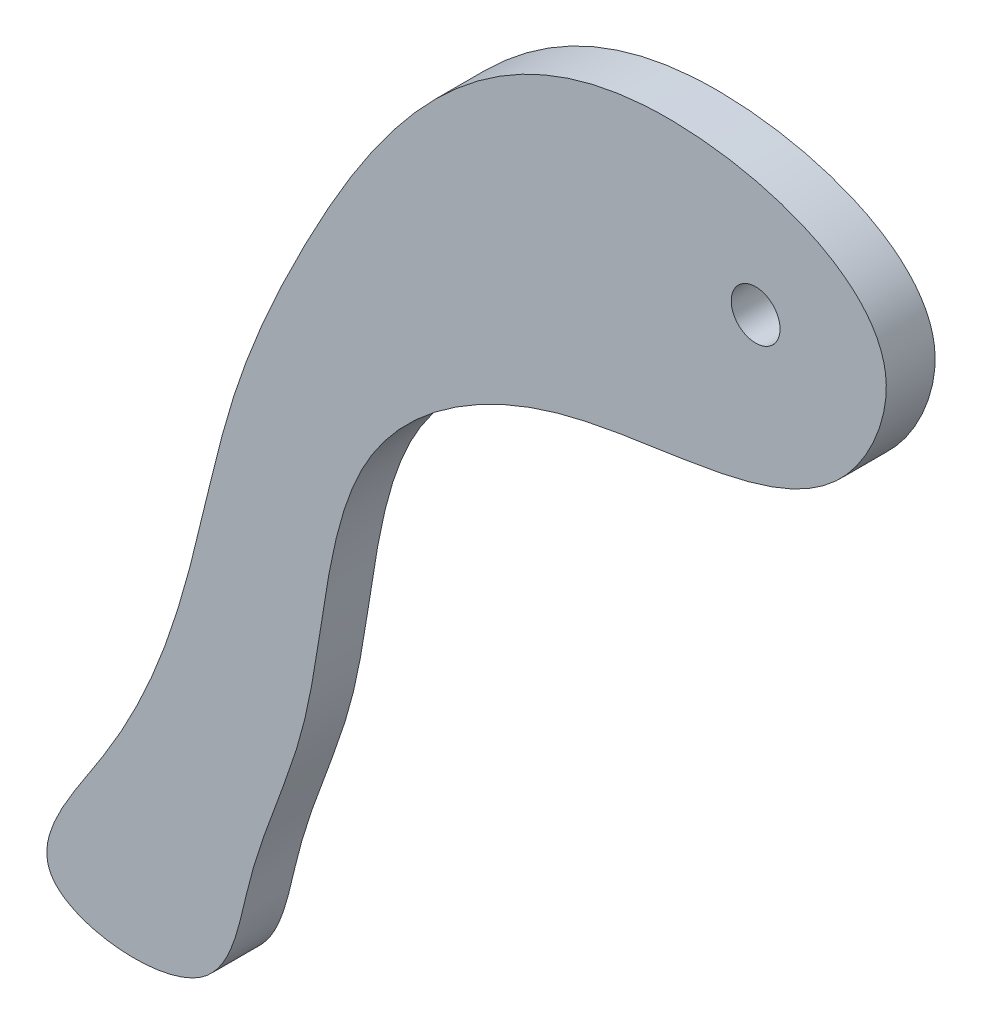
ISO-10303-21;
HEADER;
FILE_DESCRIPTION(('STEP AP214'),'2;1');
FILE_NAME('part.step','',(''),(''),'','','');
FILE_SCHEMA(('AUTOMOTIVE_DESIGN { 1 0 10303 214 1 1 1 1 }'));
ENDSEC;
DATA;
#1=APPLICATION_CONTEXT('core data for automotive mechanical design processes');
#2=APPLICATION_PROTOCOL_DEFINITION('international standard','automotive_design',2000,#1);
#3=PRODUCT_CONTEXT('',#1,'mechanical');
#4=PRODUCT('Part','Part','',(#3));
#5=PRODUCT_RELATED_PRODUCT_CATEGORY('part','',(#4));
#6=PRODUCT_DEFINITION_FORMATION('','',#4);
#7=PRODUCT_DEFINITION_CONTEXT('part definition',#1,'design');
#8=PRODUCT_DEFINITION('design','',#6,#7);
#9=PRODUCT_DEFINITION_SHAPE('','',#8);
#10=(LENGTH_UNIT() NAMED_UNIT(*) SI_UNIT(.MILLI.,.METRE.));
#11=(NAMED_UNIT(*) PLANE_ANGLE_UNIT() SI_UNIT($,.RADIAN.));
#12=(NAMED_UNIT(*) SI_UNIT($,.STERADIAN.) SOLID_ANGLE_UNIT());
#13=UNCERTAINTY_MEASURE_WITH_UNIT(LENGTH_MEASURE(1.E-05),#10,'distance_accuracy_value','');
#14=(GEOMETRIC_REPRESENTATION_CONTEXT(3) GLOBAL_UNCERTAINTY_ASSIGNED_CONTEXT((#13)) GLOBAL_UNIT_ASSIGNED_CONTEXT((#10,
#11,#12)) REPRESENTATION_CONTEXT('',''));
#15=CARTESIAN_POINT('',(0.,0.,0.));
#16=DIRECTION('',(0.,0.,1.));
#17=DIRECTION('',(1.,0.,0.));
#18=AXIS2_PLACEMENT_3D('',#15,#16,#17);
#19=CARTESIAN_POINT('',(-342.822598516437,136.186682435271,7.60003040005746));
#20=CARTESIAN_POINT('',(-343.5241752258,136.137882265139,7.60003040005746));
#21=CARTESIAN_POINT('',(-344.069151228227,135.33901925377,7.60003040005746));
#22=CARTESIAN_POINT('',(-344.648035931692,134.05432215462,7.60003040005746));
#23=CARTESIAN_POINT('',(-344.678517951387,133.180816667078,7.60003040005746));
#24=CARTESIAN_POINT('',(-345.500922911121,132.141877063834,7.60003040005746));
#25=CARTESIAN_POINT('',(-344.531964763625,132.042797781121,7.60003040005746));
#26=CARTESIAN_POINT('',(-344.44613597417,132.713640309428,7.60003040005746));
#27=CARTESIAN_POINT('',(-344.119522486674,133.370924444573,7.60003040005746));
#28=CARTESIAN_POINT('',(-344.143364824925,134.395026771742,7.60003040005746));
#29=CARTESIAN_POINT('',(-343.115444563125,135.087180778887,7.60003040005746));
#30=CARTESIAN_POINT('',(-342.061462051409,134.962837449639,7.60003040005746));
#31=CARTESIAN_POINT('',(-341.659750093632,135.994446999466,7.60003040005746));
#32=CARTESIAN_POINT('',(-342.3979561736,136.216219645243,7.60003040005746));
#33=CARTESIAN_POINT('',(-342.822598516437,136.186682435271,7.60003040005746));
#34=B_SPLINE_CURVE_WITH_KNOTS('',3,(#19,#20,#21,#22,#23,#24,#25,#26,#27,#28,#29,#30,#31,#32,
#33),.UNSPECIFIED.,.T.,.F.,(4,1,1,1,1,1,1,1,1,1,1,1,4),(0.,0.159177830000064,0.222571778534528,
0.367294655292266,0.418107249673309,0.471783736478388,0.513301840180607,0.572978205833702,
0.671765174880242,0.755128356265424,0.868017243335042,0.90365465991559,1.),.UNSPECIFIED.);
#35=DIRECTION('',(0.,0.,-1.));
#36=VECTOR('',#35,1.);
#37=SURFACE_OF_LINEAR_EXTRUSION('',#34,#36);
#38=CARTESIAN_POINT('',(-342.822598516437,136.186682435271,7.60003040005746));
#39=VERTEX_POINT('',#38);
#40=EDGE_CURVE('E10',#39,#39,#34,.T.);
#41=ORIENTED_EDGE('',*,*,#40,.F.);
#42=EDGE_LOOP('',(#41));
#43=FACE_BOUND('',#42,.T.);
#44=CARTESIAN_POINT('',(-342.822598516437,136.186682435271,7.40003040005746));
#45=CARTESIAN_POINT('',(-343.5241752258,136.137882265139,7.40003040005746));
#46=CARTESIAN_POINT('',(-344.069151228227,135.33901925377,7.40003040005746));
#47=CARTESIAN_POINT('',(-344.648035931692,134.05432215462,7.40003040005746));
#48=CARTESIAN_POINT('',(-344.678517951387,133.180816667078,7.40003040005746));
#49=CARTESIAN_POINT('',(-345.500922911121,132.141877063834,7.40003040005746));
#50=CARTESIAN_POINT('',(-344.531964763625,132.042797781121,7.40003040005746));
#51=CARTESIAN_POINT('',(-344.44613597417,132.713640309428,7.40003040005746));
#52=CARTESIAN_POINT('',(-344.119522486674,133.370924444573,7.40003040005746));
#53=CARTESIAN_POINT('',(-344.143364824925,134.395026771742,7.40003040005746));
#54=CARTESIAN_POINT('',(-343.115444563125,135.087180778887,7.40003040005746));
#55=CARTESIAN_POINT('',(-342.061462051409,134.962837449639,7.40003040005746));
#56=CARTESIAN_POINT('',(-341.659750093632,135.994446999466,7.40003040005746));
#57=CARTESIAN_POINT('',(-342.3979561736,136.216219645243,7.40003040005746));
#58=CARTESIAN_POINT('',(-342.822598516437,136.186682435271,7.40003040005746));
#59=B_SPLINE_CURVE_WITH_KNOTS('',3,(#44,#45,#46,#47,#48,#49,#50,#51,#52,#53,#54,#55,#56,#57,
#58),.UNSPECIFIED.,.T.,.F.,(4,1,1,1,1,1,1,1,1,1,1,1,4),(0.,0.159177830000064,0.222571778534528,
0.367294655292266,0.418107249673309,0.471783736478388,0.513301840180607,0.572978205833702,
0.671765174880242,0.755128356265424,0.868017243335042,0.90365465991559,1.),.UNSPECIFIED.);
#60=CARTESIAN_POINT('',(-342.822598516437,136.186682435271,7.40003040005746));
#61=VERTEX_POINT('',#60);
#62=EDGE_CURVE('E37',#61,#61,#59,.T.);
#63=ORIENTED_EDGE('',*,*,#62,.T.);
#64=EDGE_LOOP('',(#63));
#65=FACE_BOUND('',#64,.T.);
#66=ADVANCED_FACE('F33',(#43,#65),#37,.F.);
#67=CARTESIAN_POINT('',(-344.476167169649,132.459526539842,7.60003040005746));
#68=DIRECTION('',(0.,0.,-1.));
#69=DIRECTION('',(-1.,0.,0.));
#70=AXIS2_PLACEMENT_3D('',#67,#68,#69);
#71=PLANE('',#70);
#72=CARTESIAN_POINT('',(-342.362720017503,135.671782215107,7.60003040005746));
#73=DIRECTION('',(0.,0.,1.));
#74=DIRECTION('',(1.,0.,0.));
#75=AXIS2_PLACEMENT_3D('',#72,#73,#74);
#76=CIRCLE('',#75,0.100000000000001);
#77=CARTESIAN_POINT('',(-342.262720017503,135.671782215107,7.60003040005746));
#78=VERTEX_POINT('',#77);
#79=EDGE_CURVE('E50',#78,#78,#76,.T.);
#80=ORIENTED_EDGE('',*,*,#79,.F.);
#81=EDGE_LOOP('',(#80));
#82=FACE_BOUND('',#81,.T.);
#83=ORIENTED_EDGE('',*,*,#40,.T.);
#84=EDGE_LOOP('',(#83));
#85=FACE_BOUND('',#84,.T.);
#86=ADVANCED_FACE('F68',(#82,#85),#71,.F.);
#87=CARTESIAN_POINT('',(-344.476167169649,132.459526539842,7.40003040005746));
#88=DIRECTION('',(0.,0.,-1.));
#89=DIRECTION('',(-1.,0.,0.));
#90=AXIS2_PLACEMENT_3D('',#87,#88,#89);
#91=PLANE('',#90);
#92=CARTESIAN_POINT('',(-342.362720017503,135.671782215107,7.40003040005746));
#93=DIRECTION('',(0.,0.,1.));
#94=DIRECTION('',(1.,0.,0.));
#95=AXIS2_PLACEMENT_3D('',#92,#93,#94);
#96=CIRCLE('',#95,0.100000000000001);
#97=CARTESIAN_POINT('',(-342.262720017503,135.671782215107,7.40003040005746));
#98=VERTEX_POINT('',#97);
#99=EDGE_CURVE('E45',#98,#98,#96,.T.);
#100=ORIENTED_EDGE('',*,*,#99,.T.);
#101=EDGE_LOOP('',(#100));
#102=FACE_BOUND('',#101,.T.);
#103=ORIENTED_EDGE('',*,*,#62,.F.);
#104=EDGE_LOOP('',(#103));
#105=FACE_BOUND('',#104,.T.);
#106=ADVANCED_FACE('F59',(#102,#105),#91,.T.);
#107=CARTESIAN_POINT('',(-342.362720017503,135.671782215107,7.40003040005746));
#108=DIRECTION('',(0.,0.,1.));
#109=DIRECTION('',(1.,0.,0.));
#110=AXIS2_PLACEMENT_3D('',#107,#108,#109);
#111=CYLINDRICAL_SURFACE('',#110,0.100000000000001);
#112=ORIENTED_EDGE('',*,*,#99,.F.);
#113=EDGE_LOOP('',(#112));
#114=FACE_BOUND('',#113,.T.);
#115=ORIENTED_EDGE('',*,*,#79,.T.);
#116=EDGE_LOOP('',(#115));
#117=FACE_BOUND('',#116,.T.);
#118=ADVANCED_FACE('F62',(#114,#117),#111,.F.);
#119=CLOSED_SHELL('',(#66,#86,#106,#118));
#120=MANIFOLD_SOLID_BREP('B2',#119);
#121=ADVANCED_BREP_SHAPE_REPRESENTATION('',(#18,#120),#14);
#122=SHAPE_DEFINITION_REPRESENTATION(#9,#121);
ENDSEC;
END-ISO-10303-21;
